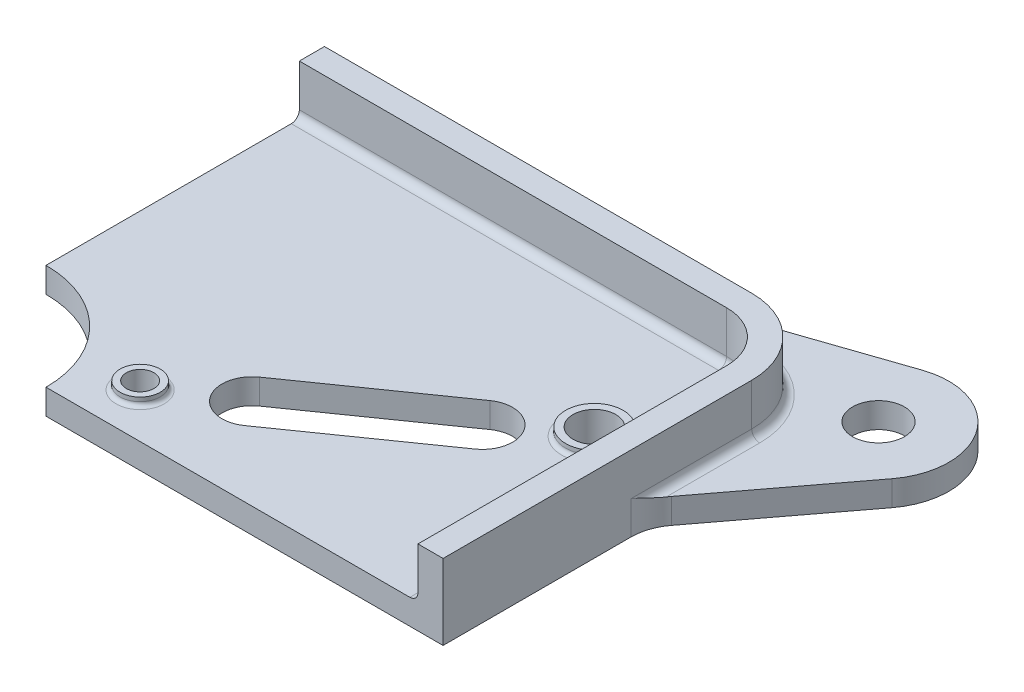
ISO-10303-21;
HEADER;
FILE_DESCRIPTION(('STEP AP214'),'2;1');
FILE_NAME('part.step','',(''),(''),'','','');
FILE_SCHEMA(('AUTOMOTIVE_DESIGN { 1 0 10303 214 1 1 1 1 }'));
ENDSEC;
DATA;
#1=APPLICATION_CONTEXT('core data for automotive mechanical design processes');
#2=APPLICATION_PROTOCOL_DEFINITION('international standard','automotive_design',2000,#1);
#3=PRODUCT_CONTEXT('',#1,'mechanical');
#4=PRODUCT('Part','Part','',(#3));
#5=PRODUCT_RELATED_PRODUCT_CATEGORY('part','',(#4));
#6=PRODUCT_DEFINITION_FORMATION('','',#4);
#7=PRODUCT_DEFINITION_CONTEXT('part definition',#1,'design');
#8=PRODUCT_DEFINITION('design','',#6,#7);
#9=PRODUCT_DEFINITION_SHAPE('','',#8);
#10=(LENGTH_UNIT() NAMED_UNIT(*) SI_UNIT(.MILLI.,.METRE.));
#11=(NAMED_UNIT(*) PLANE_ANGLE_UNIT() SI_UNIT($,.RADIAN.));
#12=(NAMED_UNIT(*) SI_UNIT($,.STERADIAN.) SOLID_ANGLE_UNIT());
#13=UNCERTAINTY_MEASURE_WITH_UNIT(LENGTH_MEASURE(1.E-05),#10,'distance_accuracy_value','');
#14=(GEOMETRIC_REPRESENTATION_CONTEXT(3) GLOBAL_UNCERTAINTY_ASSIGNED_CONTEXT((#13)) GLOBAL_UNIT_ASSIGNED_CONTEXT((#10,
#11,#12)) REPRESENTATION_CONTEXT('',''));
#15=CARTESIAN_POINT('',(0.,0.,0.));
#16=DIRECTION('',(0.,0.,1.));
#17=DIRECTION('',(1.,0.,0.));
#18=AXIS2_PLACEMENT_3D('',#15,#16,#17);
#19=CARTESIAN_POINT('',(53.975,9.525,-38.989));
#20=DIRECTION('',(0.,-1.,0.));
#21=DIRECTION('',(0.,0.,-1.));
#22=AXIS2_PLACEMENT_3D('',#19,#20,#21);
#23=PLANE('',#22);
#24=DIRECTION('',(-1.,0.,0.));
#25=VECTOR('',#24,1.);
#26=CARTESIAN_POINT('',(53.975,9.525,-45.339));
#27=LINE('',#26,#25);
#28=CARTESIAN_POINT('',(53.975,9.525,-45.339));
#29=VERTEX_POINT('',#28);
#30=CARTESIAN_POINT('',(0.,9.525,-45.339));
#31=VERTEX_POINT('',#30);
#32=EDGE_CURVE('E243',#29,#31,#27,.T.);
#33=ORIENTED_EDGE('',*,*,#32,.F.);
#34=CARTESIAN_POINT('',(53.975,9.525,-38.989));
#35=DIRECTION('',(0.,-1.,0.));
#36=DIRECTION('',(0.,0.,-1.));
#37=AXIS2_PLACEMENT_3D('',#34,#35,#36);
#38=CIRCLE('',#37,6.35);
#39=CARTESIAN_POINT('',(60.325,9.525,-38.9889999999999));
#40=VERTEX_POINT('',#39);
#41=EDGE_CURVE('E236',#40,#29,#38,.F.);
#42=ORIENTED_EDGE('',*,*,#41,.F.);
#43=DIRECTION('',(0.,0.,-1.));
#44=VECTOR('',#43,1.);
#45=CARTESIAN_POINT('',(60.325,9.525,-38.989));
#46=LINE('',#45,#44);
#47=CARTESIAN_POINT('',(60.325,9.525,0.));
#48=VERTEX_POINT('',#47);
#49=EDGE_CURVE('E248',#48,#40,#46,.T.);
#50=ORIENTED_EDGE('',*,*,#49,.F.);
#51=DIRECTION('',(1.,0.,0.));
#52=VECTOR('',#51,1.);
#53=CARTESIAN_POINT('',(13.335,9.525,0.));
#54=LINE('',#53,#52);
#55=CARTESIAN_POINT('',(63.5,9.525,0.));
#56=VERTEX_POINT('',#55);
#57=EDGE_CURVE('E296',#48,#56,#54,.T.);
#58=ORIENTED_EDGE('',*,*,#57,.T.);
#59=DIRECTION('',(0.,0.,-1.));
#60=VECTOR('',#59,1.);
#61=CARTESIAN_POINT('',(63.5,9.525,0.));
#62=LINE('',#61,#60);
#63=CARTESIAN_POINT('',(63.5,9.525,-38.9889999999999));
#64=VERTEX_POINT('',#63);
#65=EDGE_CURVE('E298',#56,#64,#62,.T.);
#66=ORIENTED_EDGE('',*,*,#65,.T.);
#67=CARTESIAN_POINT('',(53.975,9.525,-38.989));
#68=DIRECTION('',(0.,1.,0.));
#69=DIRECTION('',(0.,0.,-1.));
#70=AXIS2_PLACEMENT_3D('',#67,#68,#69);
#71=CIRCLE('',#70,9.525);
#72=CARTESIAN_POINT('',(53.9749999999999,9.525,-48.514));
#73=VERTEX_POINT('',#72);
#74=EDGE_CURVE('E300',#64,#73,#71,.T.);
#75=ORIENTED_EDGE('',*,*,#74,.T.);
#76=DIRECTION('',(-1.,0.,0.));
#77=VECTOR('',#76,1.);
#78=CARTESIAN_POINT('',(0.,9.525,-48.514));
#79=LINE('',#78,#77);
#80=CARTESIAN_POINT('',(0.,9.525,-48.514));
#81=VERTEX_POINT('',#80);
#82=EDGE_CURVE('E289',#73,#81,#79,.T.);
#83=ORIENTED_EDGE('',*,*,#82,.T.);
#84=DIRECTION('',(0.,0.,1.));
#85=VECTOR('',#84,1.);
#86=CARTESIAN_POINT('',(0.,9.525,-13.335));
#87=LINE('',#86,#85);
#88=EDGE_CURVE('E292',#81,#31,#87,.T.);
#89=ORIENTED_EDGE('',*,*,#88,.T.);
#90=EDGE_LOOP('',(#33,#42,#50,#58,#66,#75,#83,#89));
#91=FACE_BOUND('',#90,.T.);
#92=ADVANCED_FACE('F31',(#91),#23,.F.);
#93=CARTESIAN_POINT('',(0.,9.525,-13.335));
#94=DIRECTION('',(1.,0.,0.));
#95=DIRECTION('',(0.,0.,-1.));
#96=AXIS2_PLACEMENT_3D('',#93,#94,#95);
#97=PLANE('',#96);
#98=DIRECTION('',(0.,0.,1.));
#99=VECTOR('',#98,1.);
#100=CARTESIAN_POINT('',(0.,3.175,-38.989));
#101=LINE('',#100,#99);
#102=CARTESIAN_POINT('',(0.,3.175,-44.323));
#103=VERTEX_POINT('',#102);
#104=CARTESIAN_POINT('',(0.,3.175,-13.335));
#105=VERTEX_POINT('',#104);
#106=EDGE_CURVE('E255',#103,#105,#101,.T.);
#107=ORIENTED_EDGE('',*,*,#106,.F.);
#108=CARTESIAN_POINT('',(0.,4.191,-44.323));
#109=DIRECTION('',(1.,0.,0.));
#110=DIRECTION('',(0.,0.,-1.));
#111=AXIS2_PLACEMENT_3D('',#108,#109,#110);
#112=CIRCLE('',#111,1.016);
#113=CARTESIAN_POINT('',(0.,4.191,-45.339));
#114=VERTEX_POINT('',#113);
#115=EDGE_CURVE('E500',#103,#114,#112,.T.);
#116=ORIENTED_EDGE('',*,*,#115,.T.);
#117=DIRECTION('',(0.,-1.,0.));
#118=VECTOR('',#117,1.);
#119=CARTESIAN_POINT('',(0.,9.525,-45.339));
#120=LINE('',#119,#118);
#121=EDGE_CURVE('E247',#31,#114,#120,.T.);
#122=ORIENTED_EDGE('',*,*,#121,.F.);
#123=ORIENTED_EDGE('',*,*,#88,.F.);
#124=DIRECTION('',(0.,-1.,0.));
#125=VECTOR('',#124,1.);
#126=CARTESIAN_POINT('',(0.,9.525,-48.514));
#127=LINE('',#126,#125);
#128=CARTESIAN_POINT('',(0.,0.,-48.514));
#129=VERTEX_POINT('',#128);
#130=EDGE_CURVE('E325',#81,#129,#127,.T.);
#131=ORIENTED_EDGE('',*,*,#130,.T.);
#132=DIRECTION('',(0.,0.,1.));
#133=VECTOR('',#132,1.);
#134=CARTESIAN_POINT('',(0.,0.,-13.335));
#135=LINE('',#134,#133);
#136=CARTESIAN_POINT('',(0.,0.,-13.335));
#137=VERTEX_POINT('',#136);
#138=EDGE_CURVE('E304',#129,#137,#135,.T.);
#139=ORIENTED_EDGE('',*,*,#138,.T.);
#140=DIRECTION('',(0.,-1.,0.));
#141=VECTOR('',#140,1.);
#142=CARTESIAN_POINT('',(0.,9.525,-13.335));
#143=LINE('',#142,#141);
#144=EDGE_CURVE('E323',#105,#137,#143,.T.);
#145=ORIENTED_EDGE('',*,*,#144,.F.);
#146=EDGE_LOOP('',(#107,#116,#122,#123,#131,#139,#145));
#147=FACE_BOUND('',#146,.T.);
#148=ADVANCED_FACE('F438',(#147),#97,.F.);
#149=CARTESIAN_POINT('',(0.,9.525,0.));
#150=DIRECTION('',(0.,-1.,0.));
#151=DIRECTION('',(0.,0.,-1.));
#152=AXIS2_PLACEMENT_3D('',#149,#150,#151);
#153=CYLINDRICAL_SURFACE('',#152,13.335);
#154=CARTESIAN_POINT('',(0.,3.175,0.));
#155=DIRECTION('',(0.,-1.,0.));
#156=DIRECTION('',(0.,0.,-1.));
#157=AXIS2_PLACEMENT_3D('',#154,#155,#156);
#158=CIRCLE('',#157,13.335);
#159=CARTESIAN_POINT('',(13.335,3.175,0.));
#160=VERTEX_POINT('',#159);
#161=EDGE_CURVE('E244',#105,#160,#158,.T.);
#162=ORIENTED_EDGE('',*,*,#161,.F.);
#163=ORIENTED_EDGE('',*,*,#144,.T.);
#164=CARTESIAN_POINT('',(0.,0.,0.));
#165=DIRECTION('',(0.,-1.,0.));
#166=DIRECTION('',(0.,0.,1.));
#167=AXIS2_PLACEMENT_3D('',#164,#165,#166);
#168=CIRCLE('',#167,13.335);
#169=CARTESIAN_POINT('',(13.335,0.,0.));
#170=VERTEX_POINT('',#169);
#171=EDGE_CURVE('E307',#137,#170,#168,.T.);
#172=ORIENTED_EDGE('',*,*,#171,.T.);
#173=DIRECTION('',(0.,-1.,0.));
#174=VECTOR('',#173,1.);
#175=CARTESIAN_POINT('',(13.335,9.525,0.));
#176=LINE('',#175,#174);
#177=EDGE_CURVE('E321',#160,#170,#176,.T.);
#178=ORIENTED_EDGE('',*,*,#177,.F.);
#179=EDGE_LOOP('',(#162,#163,#172,#178));
#180=FACE_BOUND('',#179,.T.);
#181=ADVANCED_FACE('F444',(#180),#153,.F.);
#182=CARTESIAN_POINT('',(13.335,9.525,0.));
#183=DIRECTION('',(0.,0.,-1.));
#184=DIRECTION('',(-1.,0.,0.));
#185=AXIS2_PLACEMENT_3D('',#182,#183,#184);
#186=PLANE('',#185);
#187=DIRECTION('',(1.,0.,0.));
#188=VECTOR('',#187,1.);
#189=CARTESIAN_POINT('',(53.975,3.175,0.));
#190=LINE('',#189,#188);
#191=CARTESIAN_POINT('',(59.309,3.175,0.));
#192=VERTEX_POINT('',#191);
#193=EDGE_CURVE('E240',#160,#192,#190,.T.);
#194=ORIENTED_EDGE('',*,*,#193,.F.);
#195=ORIENTED_EDGE('',*,*,#177,.T.);
#196=DIRECTION('',(1.,0.,0.));
#197=VECTOR('',#196,1.);
#198=CARTESIAN_POINT('',(13.335,0.,0.));
#199=LINE('',#198,#197);
#200=CARTESIAN_POINT('',(63.5,0.,0.));
#201=VERTEX_POINT('',#200);
#202=EDGE_CURVE('E310',#170,#201,#199,.T.);
#203=ORIENTED_EDGE('',*,*,#202,.T.);
#204=DIRECTION('',(0.,-1.,0.));
#205=VECTOR('',#204,1.);
#206=CARTESIAN_POINT('',(63.5,9.525,0.));
#207=LINE('',#206,#205);
#208=EDGE_CURVE('E318',#56,#201,#207,.T.);
#209=ORIENTED_EDGE('',*,*,#208,.F.);
#210=ORIENTED_EDGE('',*,*,#57,.F.);
#211=DIRECTION('',(0.,-1.,0.));
#212=VECTOR('',#211,1.);
#213=CARTESIAN_POINT('',(60.325,9.525,0.));
#214=LINE('',#213,#212);
#215=CARTESIAN_POINT('',(60.325,4.191,0.));
#216=VERTEX_POINT('',#215);
#217=EDGE_CURVE('E239',#48,#216,#214,.T.);
#218=ORIENTED_EDGE('',*,*,#217,.T.);
#219=CARTESIAN_POINT('',(59.309,4.191,0.));
#220=DIRECTION('',(0.,0.,-1.));
#221=DIRECTION('',(-1.,0.,0.));
#222=AXIS2_PLACEMENT_3D('',#219,#220,#221);
#223=CIRCLE('',#222,1.016);
#224=EDGE_CURVE('E402',#216,#192,#223,.T.);
#225=ORIENTED_EDGE('',*,*,#224,.T.);
#226=EDGE_LOOP('',(#194,#195,#203,#209,#210,#218,#225));
#227=FACE_BOUND('',#226,.T.);
#228=ADVANCED_FACE('F464',(#227),#186,.F.);
#229=CARTESIAN_POINT('',(27.9025881566682,9.525,-11.4756071786794));
#230=DIRECTION('',(0.,-1.,0.));
#231=DIRECTION('',(0.,0.,-1.));
#232=AXIS2_PLACEMENT_3D('',#229,#230,#231);
#233=CYLINDRICAL_SURFACE('',#232,3.81);
#234=DIRECTION('',(0.,-1.,0.));
#235=VECTOR('',#234,1.);
#236=CARTESIAN_POINT('',(25.7172619341707,9.525,-14.5965764674205));
#237=LINE('',#236,#235);
#238=CARTESIAN_POINT('',(25.7172619341707,3.175,-14.5965764674205));
#239=VERTEX_POINT('',#238);
#240=CARTESIAN_POINT('',(25.7172619341707,0.,-14.5965764674205));
#241=VERTEX_POINT('',#240);
#242=EDGE_CURVE('E280',#239,#241,#237,.T.);
#243=ORIENTED_EDGE('',*,*,#242,.F.);
#244=CARTESIAN_POINT('',(27.9025881566682,3.175,-11.4756071786794));
#245=DIRECTION('',(0.,-1.,0.));
#246=DIRECTION('',(0.,0.,-1.));
#247=AXIS2_PLACEMENT_3D('',#244,#245,#246);
#248=CIRCLE('',#247,3.81);
#249=CARTESIAN_POINT('',(30.0879143791657,3.175,-8.35463788993839));
#250=VERTEX_POINT('',#249);
#251=EDGE_CURVE('E215',#239,#250,#248,.F.);
#252=ORIENTED_EDGE('',*,*,#251,.T.);
#253=DIRECTION('',(0.,-1.,0.));
#254=VECTOR('',#253,1.);
#255=CARTESIAN_POINT('',(30.0879143791657,9.525,-8.35463788993839));
#256=LINE('',#255,#254);
#257=CARTESIAN_POINT('',(30.0879143791657,0.,-8.35463788993839));
#258=VERTEX_POINT('',#257);
#259=EDGE_CURVE('E286',#250,#258,#256,.T.);
#260=ORIENTED_EDGE('',*,*,#259,.T.);
#261=CARTESIAN_POINT('',(27.9025881566682,0.,-11.4756071786794));
#262=DIRECTION('',(0.,1.,0.));
#263=DIRECTION('',(0.,0.,1.));
#264=AXIS2_PLACEMENT_3D('',#261,#262,#263);
#265=CIRCLE('',#264,3.81);
#266=EDGE_CURVE('E254',#241,#258,#265,.T.);
#267=ORIENTED_EDGE('',*,*,#266,.F.);
#268=EDGE_LOOP('',(#243,#252,#260,#267));
#269=FACE_BOUND('',#268,.T.);
#270=ADVANCED_FACE('F449',(#269),#233,.F.);
#271=CARTESIAN_POINT('',(30.0879143791657,9.525,-8.35463788993839));
#272=DIRECTION('',(-0.573576436351047,0.,-0.819152044288991));
#273=DIRECTION('',(-0.819152044288991,0.,0.573576436351047));
#274=AXIS2_PLACEMENT_3D('',#271,#272,#273);
#275=PLANE('',#274);
#276=ORIENTED_EDGE('',*,*,#259,.F.);
#277=DIRECTION('',(0.819152044288991,0.,-0.573576436351047));
#278=VECTOR('',#277,1.);
#279=CARTESIAN_POINT('',(60.5098314220721,3.175,-29.656293530172));
#280=LINE('',#279,#278);
#281=CARTESIAN_POINT('',(47.1970680200442,3.175,-20.3345962416696));
#282=VERTEX_POINT('',#281);
#283=EDGE_CURVE('E264',#250,#282,#280,.T.);
#284=ORIENTED_EDGE('',*,*,#283,.T.);
#285=DIRECTION('',(0.,-1.,0.));
#286=VECTOR('',#285,1.);
#287=CARTESIAN_POINT('',(47.1970680200442,9.525,-20.3345962416696));
#288=LINE('',#287,#286);
#289=CARTESIAN_POINT('',(47.1970680200442,0.,-20.3345962416696));
#290=VERTEX_POINT('',#289);
#291=EDGE_CURVE('E284',#282,#290,#288,.T.);
#292=ORIENTED_EDGE('',*,*,#291,.T.);
#293=DIRECTION('',(0.819152044288991,0.,-0.573576436351047));
#294=VECTOR('',#293,1.);
#295=CARTESIAN_POINT('',(30.0879143791657,0.,-8.35463788993839));
#296=LINE('',#295,#294);
#297=EDGE_CURVE('E271',#258,#290,#296,.T.);
#298=ORIENTED_EDGE('',*,*,#297,.F.);
#299=EDGE_LOOP('',(#276,#284,#292,#298));
#300=FACE_BOUND('',#299,.T.);
#301=ADVANCED_FACE('F563',(#300),#275,.T.);
#302=CARTESIAN_POINT('',(45.0117417975467,9.525,-23.4555655304107));
#303=DIRECTION('',(0.,-1.,0.));
#304=DIRECTION('',(0.,0.,-1.));
#305=AXIS2_PLACEMENT_3D('',#302,#303,#304);
#306=CYLINDRICAL_SURFACE('',#305,3.81);
#307=ORIENTED_EDGE('',*,*,#291,.F.);
#308=CARTESIAN_POINT('',(45.0117417975467,3.175,-23.4555655304107));
#309=DIRECTION('',(0.,-1.,0.));
#310=DIRECTION('',(0.,0.,-1.));
#311=AXIS2_PLACEMENT_3D('',#308,#309,#310);
#312=CIRCLE('',#311,3.81);
#313=CARTESIAN_POINT('',(42.8264155750492,3.175,-26.5765348191517));
#314=VERTEX_POINT('',#313);
#315=EDGE_CURVE('E261',#282,#314,#312,.F.);
#316=ORIENTED_EDGE('',*,*,#315,.T.);
#317=DIRECTION('',(0.,-1.,0.));
#318=VECTOR('',#317,1.);
#319=CARTESIAN_POINT('',(42.8264155750492,9.525,-26.5765348191517));
#320=LINE('',#319,#318);
#321=CARTESIAN_POINT('',(42.8264155750492,0.,-26.5765348191517));
#322=VERTEX_POINT('',#321);
#323=EDGE_CURVE('E282',#314,#322,#320,.T.);
#324=ORIENTED_EDGE('',*,*,#323,.T.);
#325=CARTESIAN_POINT('',(45.0117417975467,0.,-23.4555655304107));
#326=DIRECTION('',(0.,1.,0.));
#327=DIRECTION('',(0.,0.,1.));
#328=AXIS2_PLACEMENT_3D('',#325,#326,#327);
#329=CIRCLE('',#328,3.81);
#330=EDGE_CURVE('E274',#290,#322,#329,.T.);
#331=ORIENTED_EDGE('',*,*,#330,.F.);
#332=EDGE_LOOP('',(#307,#316,#324,#331));
#333=FACE_BOUND('',#332,.T.);
#334=ADVANCED_FACE('F555',(#333),#306,.F.);
#335=CARTESIAN_POINT('',(25.7172619341707,9.525,-14.5965764674205));
#336=DIRECTION('',(0.573576436351047,0.,0.819152044288991));
#337=DIRECTION('',(0.819152044288991,0.,-0.573576436351048));
#338=AXIS2_PLACEMENT_3D('',#335,#336,#337);
#339=PLANE('',#338);
#340=ORIENTED_EDGE('',*,*,#323,.F.);
#341=DIRECTION('',(-0.819152044288991,0.,0.573576436351048));
#342=VECTOR('',#341,1.);
#343=CARTESIAN_POINT('',(56.1391789770771,3.175,-35.8982321076541));
#344=LINE('',#343,#342);
#345=EDGE_CURVE('E257',#314,#239,#344,.T.);
#346=ORIENTED_EDGE('',*,*,#345,.T.);
#347=ORIENTED_EDGE('',*,*,#242,.T.);
#348=DIRECTION('',(-0.819152044288991,0.,0.573576436351047));
#349=VECTOR('',#348,1.);
#350=CARTESIAN_POINT('',(25.7172619341707,0.,-14.5965764674205));
#351=LINE('',#350,#349);
#352=EDGE_CURVE('E277',#322,#241,#351,.T.);
#353=ORIENTED_EDGE('',*,*,#352,.F.);
#354=EDGE_LOOP('',(#340,#346,#347,#353));
#355=FACE_BOUND('',#354,.T.);
#356=ADVANCED_FACE('F454',(#355),#339,.T.);
#357=CARTESIAN_POINT('',(53.975,0.,-38.989));
#358=DIRECTION('',(0.,-1.,0.));
#359=DIRECTION('',(0.,0.,-1.));
#360=AXIS2_PLACEMENT_3D('',#357,#358,#359);
#361=PLANE('',#360);
#362=CARTESIAN_POINT('',(19.5800033866921,0.,-5.6480705853528));
#363=DIRECTION('',(0.,1.,0.));
#364=DIRECTION('',(0.,0.,1.));
#365=AXIS2_PLACEMENT_3D('',#362,#363,#364);
#366=CIRCLE('',#365,1.7399);
#367=CARTESIAN_POINT('',(19.5800033866921,0.,-3.9081705853528));
#368=VERTEX_POINT('',#367);
#369=EDGE_CURVE('E621',#368,#368,#366,.T.);
#370=ORIENTED_EDGE('',*,*,#369,.T.);
#371=EDGE_LOOP('',(#370));
#372=FACE_BOUND('',#371,.T.);
#373=CARTESIAN_POINT('',(53.3343265675228,0.,-29.2831021237373));
#374=DIRECTION('',(0.,1.,0.));
#375=DIRECTION('',(0.,0.,1.));
#376=AXIS2_PLACEMENT_3D('',#373,#374,#375);
#377=CIRCLE('',#376,2.70883195162614);
#378=CARTESIAN_POINT('',(53.3343265675228,0.,-26.5742701721112));
#379=VERTEX_POINT('',#378);
#380=EDGE_CURVE('E617',#379,#379,#377,.T.);
#381=ORIENTED_EDGE('',*,*,#380,.T.);
#382=EDGE_LOOP('',(#381));
#383=FACE_BOUND('',#382,.T.);
#384=DIRECTION('',(-1.,0.,0.));
#385=VECTOR('',#384,1.);
#386=CARTESIAN_POINT('',(0.,0.,-48.514));
#387=LINE('',#386,#385);
#388=CARTESIAN_POINT('',(40.2719621883183,0.,-48.514));
#389=VERTEX_POINT('',#388);
#390=EDGE_CURVE('E288',#389,#129,#387,.T.);
#391=ORIENTED_EDGE('',*,*,#390,.F.);
#392=CARTESIAN_POINT('',(40.2719621883183,0.,-54.864));
#393=DIRECTION('',(0.,-1.,0.));
#394=DIRECTION('',(0.,0.,-1.));
#395=AXIS2_PLACEMENT_3D('',#392,#393,#394);
#396=CIRCLE('',#395,6.35);
#397=CARTESIAN_POINT('',(42.3231435718088,0.,-48.8544114174079));
#398=VERTEX_POINT('',#397);
#399=EDGE_CURVE('E335',#389,#398,#396,.F.);
#400=ORIENTED_EDGE('',*,*,#399,.T.);
#401=DIRECTION('',(-0.946391902770415,0.,0.323020690313474));
#402=VECTOR('',#401,1.);
#403=CARTESIAN_POINT('',(41.3258,0.,-48.514));
#404=LINE('',#403,#402);
#405=CARTESIAN_POINT('',(66.8299935116635,0.,-57.2190429847396));
#406=VERTEX_POINT('',#405);
#407=EDGE_CURVE('E206',#406,#398,#404,.T.);
#408=ORIENTED_EDGE('',*,*,#407,.F.);
#409=CARTESIAN_POINT('',(69.7016474485502,0.,-48.8056189691106));
#410=DIRECTION('',(0.,1.,0.));
#411=DIRECTION('',(0.,0.,1.));
#412=AXIS2_PLACEMENT_3D('',#409,#410,#411);
#413=CIRCLE('',#412,8.88999999999998);
#414=CARTESIAN_POINT('',(76.7937093319148,0.,-43.4451378113668));
#415=VERTEX_POINT('',#414);
#416=EDGE_CURVE('E227',#415,#406,#413,.T.);
#417=ORIENTED_EDGE('',*,*,#416,.F.);
#418=DIRECTION('',(0.602978757901443,0.,-0.797757242223242));
#419=VECTOR('',#418,1.);
#420=CARTESIAN_POINT('',(63.5,0.,-25.8572));
#421=LINE('',#420,#419);
#422=CARTESIAN_POINT('',(64.7842415118824,0.,-27.5562863333785));
#423=VERTEX_POINT('',#422);
#424=EDGE_CURVE('E212',#423,#415,#421,.T.);
#425=ORIENTED_EDGE('',*,*,#424,.F.);
#426=CARTESIAN_POINT('',(69.85,0.,-23.7273712207044));
#427=DIRECTION('',(0.,-1.,0.));
#428=DIRECTION('',(0.,0.,-1.));
#429=AXIS2_PLACEMENT_3D('',#426,#427,#428);
#430=CIRCLE('',#429,6.35);
#431=CARTESIAN_POINT('',(63.5,0.,-23.7273712207044));
#432=VERTEX_POINT('',#431);
#433=EDGE_CURVE('E337',#423,#432,#430,.F.);
#434=ORIENTED_EDGE('',*,*,#433,.T.);
#435=DIRECTION('',(0.,0.,-1.));
#436=VECTOR('',#435,1.);
#437=CARTESIAN_POINT('',(63.5,0.,0.));
#438=LINE('',#437,#436);
#439=EDGE_CURVE('E293',#201,#432,#438,.T.);
#440=ORIENTED_EDGE('',*,*,#439,.F.);
#441=ORIENTED_EDGE('',*,*,#202,.F.);
#442=ORIENTED_EDGE('',*,*,#171,.F.);
#443=ORIENTED_EDGE('',*,*,#138,.F.);
#444=EDGE_LOOP('',(#391,#400,#408,#417,#425,#434,#440,#441,#442,#443));
#445=FACE_BOUND('',#444,.T.);
#446=ORIENTED_EDGE('',*,*,#352,.T.);
#447=ORIENTED_EDGE('',*,*,#266,.T.);
#448=ORIENTED_EDGE('',*,*,#297,.T.);
#449=ORIENTED_EDGE('',*,*,#330,.T.);
#450=EDGE_LOOP('',(#446,#447,#448,#449));
#451=FACE_BOUND('',#450,.T.);
#452=CARTESIAN_POINT('',(69.7016474485502,0.,-48.8056189691106));
#453=DIRECTION('',(0.,1.,0.));
#454=DIRECTION('',(0.,0.,1.));
#455=AXIS2_PLACEMENT_3D('',#452,#453,#454);
#456=CIRCLE('',#455,3.27290841220234);
#457=CARTESIAN_POINT('',(69.7016474485502,0.,-45.5327105569083));
#458=VERTEX_POINT('',#457);
#459=EDGE_CURVE('E632',#458,#458,#456,.T.);
#460=ORIENTED_EDGE('',*,*,#459,.T.);
#461=EDGE_LOOP('',(#460));
#462=FACE_BOUND('',#461,.T.);
#463=ADVANCED_FACE('F451',(#372,#383,#445,#451,#462),#361,.T.);
#464=CARTESIAN_POINT('',(0.,9.525,-48.514));
#465=DIRECTION('',(0.,0.,1.));
#466=DIRECTION('',(1.,0.,0.));
#467=AXIS2_PLACEMENT_3D('',#464,#465,#466);
#468=PLANE('',#467);
#469=DIRECTION('',(0.,-1.,0.));
#470=VECTOR('',#469,1.);
#471=CARTESIAN_POINT('',(53.9749999999999,9.525,-48.514));
#472=LINE('',#471,#470);
#473=CARTESIAN_POINT('',(53.9749999999999,4.191,-48.514));
#474=VERTEX_POINT('',#473);
#475=EDGE_CURVE('E302',#73,#474,#472,.T.);
#476=ORIENTED_EDGE('',*,*,#475,.T.);
#477=DIRECTION('',(1.,0.,0.));
#478=VECTOR('',#477,1.);
#479=CARTESIAN_POINT('',(0.,4.191,-48.514));
#480=LINE('',#479,#478);
#481=CARTESIAN_POINT('',(40.2719621883183,4.191,-48.514));
#482=VERTEX_POINT('',#481);
#483=EDGE_CURVE('E347',#474,#482,#480,.F.);
#484=ORIENTED_EDGE('',*,*,#483,.T.);
#485=DIRECTION('',(0.,-1.,0.));
#486=VECTOR('',#485,1.);
#487=CARTESIAN_POINT('',(40.2719621883183,0.,-48.514));
#488=LINE('',#487,#486);
#489=EDGE_CURVE('E328',#482,#389,#488,.T.);
#490=ORIENTED_EDGE('',*,*,#489,.T.);
#491=ORIENTED_EDGE('',*,*,#390,.T.);
#492=ORIENTED_EDGE('',*,*,#130,.F.);
#493=ORIENTED_EDGE('',*,*,#82,.F.);
#494=EDGE_LOOP('',(#476,#484,#490,#491,#492,#493));
#495=FACE_BOUND('',#494,.T.);
#496=ADVANCED_FACE('F387',(#495),#468,.F.);
#497=CARTESIAN_POINT('',(63.5,9.525,0.));
#498=DIRECTION('',(-1.,0.,0.));
#499=DIRECTION('',(0.,0.,1.));
#500=AXIS2_PLACEMENT_3D('',#497,#498,#499);
#501=PLANE('',#500);
#502=DIRECTION('',(0.,-1.,0.));
#503=VECTOR('',#502,1.);
#504=CARTESIAN_POINT('',(63.5,3.175,-23.7273712207044));
#505=LINE('',#504,#503);
#506=CARTESIAN_POINT('',(63.5,4.191,-23.7273712207044));
#507=VERTEX_POINT('',#506);
#508=EDGE_CURVE('E54',#432,#507,#505,.F.);
#509=ORIENTED_EDGE('',*,*,#508,.T.);
#510=DIRECTION('',(0.,0.,1.));
#511=VECTOR('',#510,1.);
#512=CARTESIAN_POINT('',(63.5,4.191,0.));
#513=LINE('',#512,#511);
#514=CARTESIAN_POINT('',(63.5,4.191,-38.9889999999999));
#515=VERTEX_POINT('',#514);
#516=EDGE_CURVE('E365',#507,#515,#513,.F.);
#517=ORIENTED_EDGE('',*,*,#516,.T.);
#518=DIRECTION('',(0.,-1.,0.));
#519=VECTOR('',#518,1.);
#520=CARTESIAN_POINT('',(63.5,9.525,-38.9889999999999));
#521=LINE('',#520,#519);
#522=EDGE_CURVE('E315',#64,#515,#521,.T.);
#523=ORIENTED_EDGE('',*,*,#522,.F.);
#524=ORIENTED_EDGE('',*,*,#65,.F.);
#525=ORIENTED_EDGE('',*,*,#208,.T.);
#526=ORIENTED_EDGE('',*,*,#439,.T.);
#527=EDGE_LOOP('',(#509,#517,#523,#524,#525,#526));
#528=FACE_BOUND('',#527,.T.);
#529=ADVANCED_FACE('F460',(#528),#501,.F.);
#530=CARTESIAN_POINT('',(53.975,9.525,-38.989));
#531=DIRECTION('',(0.,-1.,0.));
#532=DIRECTION('',(0.,0.,-1.));
#533=AXIS2_PLACEMENT_3D('',#530,#531,#532);
#534=CYLINDRICAL_SURFACE('',#533,9.525);
#535=ORIENTED_EDGE('',*,*,#522,.T.);
#536=CARTESIAN_POINT('',(53.975,4.191,-38.989));
#537=DIRECTION('',(0.,1.,0.));
#538=DIRECTION('',(0.,0.,1.));
#539=AXIS2_PLACEMENT_3D('',#536,#537,#538);
#540=CIRCLE('',#539,9.525);
#541=EDGE_CURVE('E363',#515,#474,#540,.T.);
#542=ORIENTED_EDGE('',*,*,#541,.T.);
#543=ORIENTED_EDGE('',*,*,#475,.F.);
#544=ORIENTED_EDGE('',*,*,#74,.F.);
#545=EDGE_LOOP('',(#535,#542,#543,#544));
#546=FACE_BOUND('',#545,.T.);
#547=ADVANCED_FACE('F456',(#546),#534,.T.);
#548=CARTESIAN_POINT('',(53.975,3.175,-38.989));
#549=DIRECTION('',(0.,-1.,0.));
#550=DIRECTION('',(0.,0.,-1.));
#551=AXIS2_PLACEMENT_3D('',#548,#549,#550);
#552=PLANE('',#551);
#553=CARTESIAN_POINT('',(53.3343265675228,3.175,-29.2831021237373));
#554=DIRECTION('',(0.,-1.,0.));
#555=DIRECTION('',(0.,0.,-1.));
#556=AXIS2_PLACEMENT_3D('',#553,#554,#555);
#557=CIRCLE('',#556,4.14155411699203);
#558=CARTESIAN_POINT('',(53.3343265675228,3.175,-33.4246562407293));
#559=VERTEX_POINT('',#558);
#560=EDGE_CURVE('E39',#559,#559,#557,.T.);
#561=ORIENTED_EDGE('',*,*,#560,.T.);
#562=EDGE_LOOP('',(#561));
#563=FACE_BOUND('',#562,.T.);
#564=CARTESIAN_POINT('',(19.5800033866921,3.175,-5.6480705853528));
#565=DIRECTION('',(0.,-1.,0.));
#566=DIRECTION('',(0.,0.,-1.));
#567=AXIS2_PLACEMENT_3D('',#564,#565,#566);
#568=CIRCLE('',#567,3.048);
#569=CARTESIAN_POINT('',(19.5800033866921,3.175,-8.6960705853528));
#570=VERTEX_POINT('',#569);
#571=EDGE_CURVE('E541',#570,#570,#568,.T.);
#572=ORIENTED_EDGE('',*,*,#571,.T.);
#573=EDGE_LOOP('',(#572));
#574=FACE_BOUND('',#573,.T.);
#575=CARTESIAN_POINT('',(53.975,3.175,-38.989));
#576=DIRECTION('',(0.,-1.,0.));
#577=DIRECTION('',(0.,0.,-1.));
#578=AXIS2_PLACEMENT_3D('',#575,#576,#577);
#579=CIRCLE('',#578,5.334);
#580=CARTESIAN_POINT('',(59.309,3.175,-38.989));
#581=VERTEX_POINT('',#580);
#582=CARTESIAN_POINT('',(53.9749999999999,3.175,-44.323));
#583=VERTEX_POINT('',#582);
#584=EDGE_CURVE('E352',#581,#583,#579,.F.);
#585=ORIENTED_EDGE('',*,*,#584,.T.);
#586=DIRECTION('',(-1.,0.,0.));
#587=VECTOR('',#586,1.);
#588=CARTESIAN_POINT('',(53.975,3.175,-44.323));
#589=LINE('',#588,#587);
#590=EDGE_CURVE('E354',#583,#103,#589,.T.);
#591=ORIENTED_EDGE('',*,*,#590,.T.);
#592=ORIENTED_EDGE('',*,*,#106,.T.);
#593=ORIENTED_EDGE('',*,*,#161,.T.);
#594=ORIENTED_EDGE('',*,*,#193,.T.);
#595=DIRECTION('',(0.,0.,-1.));
#596=VECTOR('',#595,1.);
#597=CARTESIAN_POINT('',(59.309,3.175,-38.989));
#598=LINE('',#597,#596);
#599=EDGE_CURVE('E350',#192,#581,#598,.T.);
#600=ORIENTED_EDGE('',*,*,#599,.T.);
#601=EDGE_LOOP('',(#585,#591,#592,#593,#594,#600));
#602=FACE_BOUND('',#601,.T.);
#603=ORIENTED_EDGE('',*,*,#345,.F.);
#604=ORIENTED_EDGE('',*,*,#315,.F.);
#605=ORIENTED_EDGE('',*,*,#283,.F.);
#606=ORIENTED_EDGE('',*,*,#251,.F.);
#607=EDGE_LOOP('',(#603,#604,#605,#606));
#608=FACE_BOUND('',#607,.T.);
#609=ADVANCED_FACE('F459',(#563,#574,#602,#608),#552,.F.);
#610=CARTESIAN_POINT('',(0.,9.525,-45.339));
#611=DIRECTION('',(0.,0.,1.));
#612=DIRECTION('',(1.,0.,0.));
#613=AXIS2_PLACEMENT_3D('',#610,#611,#612);
#614=PLANE('',#613);
#615=ORIENTED_EDGE('',*,*,#121,.T.);
#616=DIRECTION('',(-1.,0.,0.));
#617=VECTOR('',#616,1.);
#618=CARTESIAN_POINT('',(0.,4.191,-45.339));
#619=LINE('',#618,#617);
#620=CARTESIAN_POINT('',(53.9749999999999,4.191,-45.339));
#621=VERTEX_POINT('',#620);
#622=EDGE_CURVE('E357',#114,#621,#619,.F.);
#623=ORIENTED_EDGE('',*,*,#622,.T.);
#624=DIRECTION('',(0.,1.,0.));
#625=VECTOR('',#624,1.);
#626=CARTESIAN_POINT('',(53.9749999999999,9.525,-45.339));
#627=LINE('',#626,#625);
#628=EDGE_CURVE('E232',#29,#621,#627,.F.);
#629=ORIENTED_EDGE('',*,*,#628,.F.);
#630=ORIENTED_EDGE('',*,*,#32,.T.);
#631=EDGE_LOOP('',(#615,#623,#629,#630));
#632=FACE_BOUND('',#631,.T.);
#633=ADVANCED_FACE('F524',(#632),#614,.T.);
#634=CARTESIAN_POINT('',(60.325,9.525,0.));
#635=DIRECTION('',(-1.,0.,0.));
#636=DIRECTION('',(0.,0.,1.));
#637=AXIS2_PLACEMENT_3D('',#634,#635,#636);
#638=PLANE('',#637);
#639=DIRECTION('',(0.,-1.,0.));
#640=VECTOR('',#639,1.);
#641=CARTESIAN_POINT('',(60.325,9.525,-38.9889999999999));
#642=LINE('',#641,#640);
#643=CARTESIAN_POINT('',(60.325,4.191,-38.9889999999999));
#644=VERTEX_POINT('',#643);
#645=EDGE_CURVE('E235',#40,#644,#642,.T.);
#646=ORIENTED_EDGE('',*,*,#645,.T.);
#647=DIRECTION('',(0.,0.,-1.));
#648=VECTOR('',#647,1.);
#649=CARTESIAN_POINT('',(60.325,4.191,0.));
#650=LINE('',#649,#648);
#651=EDGE_CURVE('E361',#644,#216,#650,.F.);
#652=ORIENTED_EDGE('',*,*,#651,.T.);
#653=ORIENTED_EDGE('',*,*,#217,.F.);
#654=ORIENTED_EDGE('',*,*,#49,.T.);
#655=EDGE_LOOP('',(#646,#652,#653,#654));
#656=FACE_BOUND('',#655,.T.);
#657=ADVANCED_FACE('F579',(#656),#638,.T.);
#658=CARTESIAN_POINT('',(53.975,9.525,-38.989));
#659=DIRECTION('',(0.,-1.,0.));
#660=DIRECTION('',(0.,0.,-1.));
#661=AXIS2_PLACEMENT_3D('',#658,#659,#660);
#662=CYLINDRICAL_SURFACE('',#661,6.35);
#663=ORIENTED_EDGE('',*,*,#628,.T.);
#664=CARTESIAN_POINT('',(53.975,4.191,-38.989));
#665=DIRECTION('',(0.,-1.,0.));
#666=DIRECTION('',(0.,0.,-1.));
#667=AXIS2_PLACEMENT_3D('',#664,#665,#666);
#668=CIRCLE('',#667,6.35);
#669=EDGE_CURVE('E359',#621,#644,#668,.T.);
#670=ORIENTED_EDGE('',*,*,#669,.T.);
#671=ORIENTED_EDGE('',*,*,#645,.F.);
#672=ORIENTED_EDGE('',*,*,#41,.T.);
#673=EDGE_LOOP('',(#663,#670,#671,#672));
#674=FACE_BOUND('',#673,.T.);
#675=ADVANCED_FACE('F576',(#674),#662,.F.);
#676=CARTESIAN_POINT('',(69.7016474485502,3.175,-48.8056189691106));
#677=DIRECTION('',(0.,1.,0.));
#678=DIRECTION('',(0.,0.,1.));
#679=AXIS2_PLACEMENT_3D('',#676,#677,#678);
#680=PLANE('',#679);
#681=DIRECTION('',(-0.946391902770415,0.,0.323020690313474));
#682=VECTOR('',#681,1.);
#683=CARTESIAN_POINT('',(41.3258,3.175,-48.514));
#684=LINE('',#683,#682);
#685=CARTESIAN_POINT('',(66.8299935116635,3.175,-57.2190429847396));
#686=VERTEX_POINT('',#685);
#687=CARTESIAN_POINT('',(44.3024953079124,3.175,-49.53));
#688=VERTEX_POINT('',#687);
#689=EDGE_CURVE('E221',#686,#688,#684,.T.);
#690=ORIENTED_EDGE('',*,*,#689,.T.);
#691=DIRECTION('',(1.,0.,0.));
#692=VECTOR('',#691,1.);
#693=CARTESIAN_POINT('',(69.7016474485502,3.175,-49.53));
#694=LINE('',#693,#692);
#695=CARTESIAN_POINT('',(53.9749999999999,3.175,-49.53));
#696=VERTEX_POINT('',#695);
#697=EDGE_CURVE('E344',#688,#696,#694,.T.);
#698=ORIENTED_EDGE('',*,*,#697,.T.);
#699=CARTESIAN_POINT('',(53.975,3.175,-38.989));
#700=DIRECTION('',(0.,1.,0.));
#701=DIRECTION('',(0.,0.,1.));
#702=AXIS2_PLACEMENT_3D('',#699,#700,#701);
#703=CIRCLE('',#702,10.541);
#704=CARTESIAN_POINT('',(64.516,3.175,-38.9889999999999));
#705=VERTEX_POINT('',#704);
#706=EDGE_CURVE('E342',#696,#705,#703,.F.);
#707=ORIENTED_EDGE('',*,*,#706,.T.);
#708=DIRECTION('',(0.,0.,1.));
#709=VECTOR('',#708,1.);
#710=CARTESIAN_POINT('',(64.516,3.175,-48.8056189691106));
#711=LINE('',#710,#709);
#712=CARTESIAN_POINT('',(64.516,3.175,-27.172794852132));
#713=VERTEX_POINT('',#712);
#714=EDGE_CURVE('E340',#705,#713,#711,.T.);
#715=ORIENTED_EDGE('',*,*,#714,.T.);
#716=CARTESIAN_POINT('',(69.85,3.175,-23.7273712207044));
#717=DIRECTION('',(0.,1.,0.));
#718=DIRECTION('',(0.,0.,1.));
#719=AXIS2_PLACEMENT_3D('',#716,#717,#718);
#720=CIRCLE('',#719,6.35);
#721=CARTESIAN_POINT('',(64.7842415118824,3.175,-27.5562863333785));
#722=VERTEX_POINT('',#721);
#723=EDGE_CURVE('E202',#713,#722,#720,.F.);
#724=ORIENTED_EDGE('',*,*,#723,.T.);
#725=DIRECTION('',(0.602978757901443,0.,-0.797757242223242));
#726=VECTOR('',#725,1.);
#727=CARTESIAN_POINT('',(63.5,3.175,-25.8572));
#728=LINE('',#727,#726);
#729=CARTESIAN_POINT('',(76.7937093319148,3.175,-43.4451378113668));
#730=VERTEX_POINT('',#729);
#731=EDGE_CURVE('E193',#722,#730,#728,.T.);
#732=ORIENTED_EDGE('',*,*,#731,.T.);
#733=CARTESIAN_POINT('',(69.7016474485502,3.175,-48.8056189691106));
#734=DIRECTION('',(0.,1.,0.));
#735=DIRECTION('',(0.,0.,1.));
#736=AXIS2_PLACEMENT_3D('',#733,#734,#735);
#737=CIRCLE('',#736,8.88999999999998);
#738=EDGE_CURVE('E199',#730,#686,#737,.T.);
#739=ORIENTED_EDGE('',*,*,#738,.T.);
#740=EDGE_LOOP('',(#690,#698,#707,#715,#724,#732,#739));
#741=FACE_BOUND('',#740,.T.);
#742=CARTESIAN_POINT('',(69.7016474485502,3.175,-48.8056189691106));
#743=DIRECTION('',(0.,1.,0.));
#744=DIRECTION('',(0.,0.,1.));
#745=AXIS2_PLACEMENT_3D('',#742,#743,#744);
#746=CIRCLE('',#745,3.27290841220234);
#747=CARTESIAN_POINT('',(69.7016474485502,3.175,-45.5327105569083));
#748=VERTEX_POINT('',#747);
#749=EDGE_CURVE('E228',#748,#748,#746,.T.);
#750=ORIENTED_EDGE('',*,*,#749,.F.);
#751=EDGE_LOOP('',(#750));
#752=FACE_BOUND('',#751,.T.);
#753=ADVANCED_FACE('F196',(#741,#752),#680,.T.);
#754=CARTESIAN_POINT('',(63.5,3.175,-25.8572));
#755=DIRECTION('',(-0.797757242223242,0.,-0.602978757901443));
#756=DIRECTION('',(-0.602978757901443,0.,0.797757242223242));
#757=AXIS2_PLACEMENT_3D('',#754,#755,#756);
#758=PLANE('',#757);
#759=ORIENTED_EDGE('',*,*,#731,.F.);
#760=DIRECTION('',(0.,-1.,0.));
#761=VECTOR('',#760,1.);
#762=CARTESIAN_POINT('',(64.7842415118824,0.,-27.5562863333785));
#763=LINE('',#762,#761);
#764=EDGE_CURVE('E332',#722,#423,#763,.T.);
#765=ORIENTED_EDGE('',*,*,#764,.T.);
#766=ORIENTED_EDGE('',*,*,#424,.T.);
#767=DIRECTION('',(0.,-1.,0.));
#768=VECTOR('',#767,1.);
#769=CARTESIAN_POINT('',(76.7937093319148,3.175,-43.4451378113668));
#770=LINE('',#769,#768);
#771=EDGE_CURVE('E209',#730,#415,#770,.T.);
#772=ORIENTED_EDGE('',*,*,#771,.F.);
#773=EDGE_LOOP('',(#759,#765,#766,#772));
#774=FACE_BOUND('',#773,.T.);
#775=ADVANCED_FACE('F210',(#774),#758,.F.);
#776=CARTESIAN_POINT('',(69.7016474485502,3.175,-48.8056189691106));
#777=DIRECTION('',(0.,-1.,0.));
#778=DIRECTION('',(0.,0.,-1.));
#779=AXIS2_PLACEMENT_3D('',#776,#777,#778);
#780=CYLINDRICAL_SURFACE('',#779,8.88999999999998);
#781=ORIENTED_EDGE('',*,*,#416,.T.);
#782=DIRECTION('',(0.,-1.,0.));
#783=VECTOR('',#782,1.);
#784=CARTESIAN_POINT('',(66.8299935116635,3.175,-57.2190429847396));
#785=LINE('',#784,#783);
#786=EDGE_CURVE('E216',#686,#406,#785,.T.);
#787=ORIENTED_EDGE('',*,*,#786,.F.);
#788=ORIENTED_EDGE('',*,*,#738,.F.);
#789=ORIENTED_EDGE('',*,*,#771,.T.);
#790=EDGE_LOOP('',(#781,#787,#788,#789));
#791=FACE_BOUND('',#790,.T.);
#792=ADVANCED_FACE('F218',(#791),#780,.T.);
#793=CARTESIAN_POINT('',(41.3258,3.175,-48.514));
#794=DIRECTION('',(0.323020690313474,0.,0.946391902770415));
#795=DIRECTION('',(0.946391902770415,0.,-0.323020690313474));
#796=AXIS2_PLACEMENT_3D('',#793,#794,#795);
#797=PLANE('',#796);
#798=ORIENTED_EDGE('',*,*,#407,.T.);
#799=DIRECTION('',(0.,-1.,0.));
#800=VECTOR('',#799,1.);
#801=CARTESIAN_POINT('',(42.3231435718088,3.175,-48.8544114174079));
#802=LINE('',#801,#800);
#803=CARTESIAN_POINT('',(42.3231435718088,3.43216136954478,-48.8544114174079));
#804=VERTEX_POINT('',#803);
#805=EDGE_CURVE('E46',#398,#804,#802,.F.);
#806=ORIENTED_EDGE('',*,*,#805,.T.);
#807=CARTESIAN_POINT('',(44.3024953079124,4.191,-49.53));
#808=DIRECTION('',(0.323020690313474,0.,0.946391902770415));
#809=DIRECTION('',(0.946391902770415,0.,-0.323020690313474));
#810=AXIS2_PLACEMENT_3D('',#807,#808,#809);
#811=ELLIPSE('',#810,3.14530935778147,1.016);
#812=EDGE_CURVE('E374',#804,#688,#811,.T.);
#813=ORIENTED_EDGE('',*,*,#812,.T.);
#814=ORIENTED_EDGE('',*,*,#689,.F.);
#815=ORIENTED_EDGE('',*,*,#786,.T.);
#816=EDGE_LOOP('',(#798,#806,#813,#814,#815));
#817=FACE_BOUND('',#816,.T.);
#818=ADVANCED_FACE('F503',(#817),#797,.F.);
#819=CARTESIAN_POINT('',(69.7016474485502,3.175,-48.8056189691106));
#820=DIRECTION('',(0.,-1.,0.));
#821=DIRECTION('',(0.,0.,-1.));
#822=AXIS2_PLACEMENT_3D('',#819,#820,#821);
#823=CYLINDRICAL_SURFACE('',#822,3.27290841220234);
#824=ORIENTED_EDGE('',*,*,#749,.T.);
#825=EDGE_LOOP('',(#824));
#826=FACE_BOUND('',#825,.T.);
#827=ORIENTED_EDGE('',*,*,#459,.F.);
#828=EDGE_LOOP('',(#827));
#829=FACE_BOUND('',#828,.T.);
#830=ADVANCED_FACE('F385',(#826,#829),#823,.F.);
#831=CARTESIAN_POINT('',(40.2719621883183,9.525,-54.864));
#832=DIRECTION('',(0.,1.,0.));
#833=DIRECTION('',(0.,0.,1.));
#834=AXIS2_PLACEMENT_3D('',#831,#832,#833);
#835=CYLINDRICAL_SURFACE('',#834,6.35);
#836=ORIENTED_EDGE('',*,*,#489,.F.);
#837=CARTESIAN_POINT('',(42.3231435718088,3.43216136954478,-48.8544114174079));
#838=CARTESIAN_POINT('',(42.238932512333,3.45775949501697,-48.825670695734));
#839=CARTESIAN_POINT('',(42.1544751099239,3.48458222272569,-48.7988180140169));
#840=CARTESIAN_POINT('',(41.9851580279225,3.54027836254143,-48.7488339407517));
#841=CARTESIAN_POINT('',(41.9002984476339,3.56915129076921,-48.7257016753078));
#842=CARTESIAN_POINT('',(41.6452672177334,3.65824079577412,-48.6618031846728));
#843=CARTESIAN_POINT('',(41.4745688561062,3.72095130772643,-48.6265100846418));
#844=CARTESIAN_POINT('',(41.1344928900444,3.84965044474154,-48.5705198148112));
#845=CARTESIAN_POINT('',(40.9651241395779,3.91559049152559,-48.5496519710947));
#846=CARTESIAN_POINT('',(40.6260694712941,4.04938179279704,-48.521601718255));
#847=CARTESIAN_POINT('',(40.4563837557143,4.11723206987014,-48.5144124348296));
#848=CARTESIAN_POINT('',(40.2818271278768,4.18705402562041,-48.5140057494678));
#849=CARTESIAN_POINT('',(40.2768946288073,4.18902702532921,-48.5140000026412));
#850=CARTESIAN_POINT('',(40.2719621883183,4.191,-48.514));
#851=B_SPLINE_CURVE_WITH_KNOTS('',3,(#837,#838,#839,#840,#841,#842,#843,#844,#845,#846,#847,
#848,#849,#850),.UNSPECIFIED.,.F.,.F.,(4,2,2,2,2,2,4),(0.,0.277700790269298,0.555336255290538,
1.11036283167278,1.65870466483869,2.20677085026807,2.22270823704466),.UNSPECIFIED.);
#852=EDGE_CURVE('E367',#482,#804,#851,.F.);
#853=ORIENTED_EDGE('',*,*,#852,.T.);
#854=ORIENTED_EDGE('',*,*,#805,.F.);
#855=ORIENTED_EDGE('',*,*,#399,.F.);
#856=EDGE_LOOP('',(#836,#853,#854,#855));
#857=FACE_BOUND('',#856,.T.);
#858=ADVANCED_FACE('F380',(#857),#835,.F.);
#859=CARTESIAN_POINT('',(69.85,3.175,-23.7273712207044));
#860=DIRECTION('',(0.,1.,0.));
#861=DIRECTION('',(0.,0.,1.));
#862=AXIS2_PLACEMENT_3D('',#859,#860,#861);
#863=CYLINDRICAL_SURFACE('',#862,6.35);
#864=ORIENTED_EDGE('',*,*,#723,.F.);
#865=CARTESIAN_POINT('',(64.516,3.175,-27.172794852132));
#866=CARTESIAN_POINT('',(64.4864168684358,3.17500582056947,-27.1269979812661));
#867=CARTESIAN_POINT('',(64.4574352402799,3.17629125419772,-27.0808340811947));
#868=CARTESIAN_POINT('',(64.4007321038244,3.18115788052762,-26.9878833121274));
#869=CARTESIAN_POINT('',(64.3730100545326,3.18473807744785,-26.9410967219583));
#870=CARTESIAN_POINT('',(64.2919121615195,3.19850555672595,-26.8001370264539));
#871=CARTESIAN_POINT('',(64.2404610828012,3.21172232094086,-26.7051416196273));
#872=CARTESIAN_POINT('',(64.1431884336168,3.24448803471006,-26.5141660298307));
#873=CARTESIAN_POINT('',(64.0973348713363,3.26399842856304,-26.4181952037774));
#874=CARTESIAN_POINT('',(64.0108629119906,3.30813597891689,-26.225007643012));
#875=CARTESIAN_POINT('',(63.9702486455295,3.3327671330991,-26.1277899908989));
#876=CARTESIAN_POINT('',(63.8719226282873,3.40178650138675,-25.8751038990197));
#877=CARTESIAN_POINT('',(63.8181671543516,3.44928555161271,-25.7189369333321));
#878=CARTESIAN_POINT('',(63.7234510493125,3.55148814430438,-25.4051040936244));
#879=CARTESIAN_POINT('',(63.6824950490039,3.60619428411194,-25.2474376983264));
#880=CARTESIAN_POINT('',(63.6129734263737,3.72058901937648,-24.9308314539343));
#881=CARTESIAN_POINT('',(63.5844328592847,3.78028740290134,-24.771889682945));
#882=CARTESIAN_POINT('',(63.5396065141281,3.90263445510086,-24.4535064003554));
#883=CARTESIAN_POINT('',(63.5233159311903,3.96528195677239,-24.2940651093515));
#884=CARTESIAN_POINT('',(63.5046664527688,4.08045591316216,-24.0037710906367));
#885=CARTESIAN_POINT('',(63.5003219768454,4.13276556225426,-23.8729587546007));
#886=CARTESIAN_POINT('',(63.5000057488263,4.18705401607038,-23.7372361809573));
#887=CARTESIAN_POINT('',(63.5000000019424,4.18902701561717,-23.7323036821676));
#888=CARTESIAN_POINT('',(63.5,4.191,-23.7273712207044));
#889=B_SPLINE_CURVE_WITH_KNOTS('',3,(#865,#866,#867,#868,#869,#870,#871,#872,#873,#874,#875,
#876,#877,#878,#879,#880,#881,#882,#883,#884,#885,#886,#887,#888),.UNSPECIFIED.,.F.,.F.,(4,2,2,
2,2,2,2,2,2,2,2,4),(0.,0.16351377039212,0.326956634194098,0.653051551938133,0.977185540207122,
1.30157353045386,1.81635693605832,2.33132637305667,2.8473302877337,3.36313170198433,
3.78572442705773,3.80166181383434),.UNSPECIFIED.);
#890=EDGE_CURVE('E394',#713,#507,#889,.T.);
#891=ORIENTED_EDGE('',*,*,#890,.T.);
#892=ORIENTED_EDGE('',*,*,#508,.F.);
#893=ORIENTED_EDGE('',*,*,#433,.F.);
#894=ORIENTED_EDGE('',*,*,#764,.F.);
#895=EDGE_LOOP('',(#864,#891,#892,#893,#894));
#896=FACE_BOUND('',#895,.T.);
#897=ADVANCED_FACE('F384',(#896),#863,.F.);
#898=CARTESIAN_POINT('',(64.516,4.191,-48.8056189691106));
#899=DIRECTION('',(0.,0.,1.));
#900=DIRECTION('',(1.,0.,0.));
#901=AXIS2_PLACEMENT_3D('',#898,#899,#900);
#902=CYLINDRICAL_SURFACE('',#901,1.016);
#903=ORIENTED_EDGE('',*,*,#890,.F.);
#904=ORIENTED_EDGE('',*,*,#714,.F.);
#905=CARTESIAN_POINT('',(64.516,4.191,-38.9889999999999));
#906=DIRECTION('',(0.,0.,1.));
#907=DIRECTION('',(0.,-1.,0.));
#908=AXIS2_PLACEMENT_3D('',#905,#906,#907);
#909=CIRCLE('',#908,1.016);
#910=EDGE_CURVE('E512',#515,#705,#909,.T.);
#911=ORIENTED_EDGE('',*,*,#910,.F.);
#912=ORIENTED_EDGE('',*,*,#516,.F.);
#913=EDGE_LOOP('',(#903,#904,#911,#912));
#914=FACE_BOUND('',#913,.T.);
#915=ADVANCED_FACE('F391',(#914),#902,.F.);
#916=CARTESIAN_POINT('',(53.975,4.191,-38.989));
#917=DIRECTION('',(0.,1.,0.));
#918=DIRECTION('',(0.,0.,1.));
#919=AXIS2_PLACEMENT_3D('',#916,#917,#918);
#920=TOROIDAL_SURFACE('',#919,10.541,1.016);
#921=ORIENTED_EDGE('',*,*,#910,.T.);
#922=ORIENTED_EDGE('',*,*,#706,.F.);
#923=CARTESIAN_POINT('',(53.9749999999999,4.191,-49.53));
#924=DIRECTION('',(1.,0.,0.));
#925=DIRECTION('',(0.,1.,0.));
#926=AXIS2_PLACEMENT_3D('',#923,#924,#925);
#927=CIRCLE('',#926,1.016);
#928=EDGE_CURVE('E403',#474,#696,#927,.T.);
#929=ORIENTED_EDGE('',*,*,#928,.F.);
#930=ORIENTED_EDGE('',*,*,#541,.F.);
#931=EDGE_LOOP('',(#921,#922,#929,#930));
#932=FACE_BOUND('',#931,.T.);
#933=ADVANCED_FACE('F408',(#932),#920,.F.);
#934=CARTESIAN_POINT('',(69.7016474485502,4.191,-49.53));
#935=DIRECTION('',(1.,0.,0.));
#936=DIRECTION('',(0.,0.,-1.));
#937=AXIS2_PLACEMENT_3D('',#934,#935,#936);
#938=CYLINDRICAL_SURFACE('',#937,1.016);
#939=ORIENTED_EDGE('',*,*,#852,.F.);
#940=ORIENTED_EDGE('',*,*,#483,.F.);
#941=ORIENTED_EDGE('',*,*,#928,.T.);
#942=ORIENTED_EDGE('',*,*,#697,.F.);
#943=ORIENTED_EDGE('',*,*,#812,.F.);
#944=EDGE_LOOP('',(#939,#940,#941,#942,#943));
#945=FACE_BOUND('',#944,.T.);
#946=ADVANCED_FACE('F376',(#945),#938,.F.);
#947=CARTESIAN_POINT('',(59.309,4.191,-38.989));
#948=DIRECTION('',(0.,0.,-1.));
#949=DIRECTION('',(-1.,0.,0.));
#950=AXIS2_PLACEMENT_3D('',#947,#948,#949);
#951=CYLINDRICAL_SURFACE('',#950,1.016);
#952=ORIENTED_EDGE('',*,*,#224,.F.);
#953=ORIENTED_EDGE('',*,*,#651,.F.);
#954=CARTESIAN_POINT('',(59.309,4.191,-38.989));
#955=DIRECTION('',(0.,0.,1.));
#956=DIRECTION('',(1.,0.,0.));
#957=AXIS2_PLACEMENT_3D('',#954,#955,#956);
#958=CIRCLE('',#957,1.016);
#959=EDGE_CURVE('E513',#581,#644,#958,.T.);
#960=ORIENTED_EDGE('',*,*,#959,.F.);
#961=ORIENTED_EDGE('',*,*,#599,.F.);
#962=EDGE_LOOP('',(#952,#953,#960,#961));
#963=FACE_BOUND('',#962,.T.);
#964=ADVANCED_FACE('F419',(#963),#951,.F.);
#965=CARTESIAN_POINT('',(53.975,4.191,-38.989));
#966=DIRECTION('',(0.,-1.,0.));
#967=DIRECTION('',(0.,0.,-1.));
#968=AXIS2_PLACEMENT_3D('',#965,#966,#967);
#969=TOROIDAL_SURFACE('',#968,5.334,1.016);
#970=ORIENTED_EDGE('',*,*,#959,.T.);
#971=ORIENTED_EDGE('',*,*,#669,.F.);
#972=CARTESIAN_POINT('',(53.9749999999999,4.191,-44.323));
#973=DIRECTION('',(1.,0.,0.));
#974=DIRECTION('',(0.,0.,-1.));
#975=AXIS2_PLACEMENT_3D('',#972,#973,#974);
#976=CIRCLE('',#975,1.016);
#977=EDGE_CURVE('E529',#583,#621,#976,.T.);
#978=ORIENTED_EDGE('',*,*,#977,.F.);
#979=ORIENTED_EDGE('',*,*,#584,.F.);
#980=EDGE_LOOP('',(#970,#971,#978,#979));
#981=FACE_BOUND('',#980,.T.);
#982=ADVANCED_FACE('F414',(#981),#969,.F.);
#983=CARTESIAN_POINT('',(53.975,4.191,-44.323));
#984=DIRECTION('',(-1.,0.,0.));
#985=DIRECTION('',(0.,0.,1.));
#986=AXIS2_PLACEMENT_3D('',#983,#984,#985);
#987=CYLINDRICAL_SURFACE('',#986,1.016);
#988=ORIENTED_EDGE('',*,*,#977,.T.);
#989=ORIENTED_EDGE('',*,*,#622,.F.);
#990=ORIENTED_EDGE('',*,*,#115,.F.);
#991=ORIENTED_EDGE('',*,*,#590,.F.);
#992=EDGE_LOOP('',(#988,#989,#990,#991));
#993=FACE_BOUND('',#992,.T.);
#994=ADVANCED_FACE('F410',(#993),#987,.F.);
#995=CARTESIAN_POINT('',(19.5800033866921,4.191,-5.6480705853528));
#996=DIRECTION('',(0.,1.,0.));
#997=DIRECTION('',(0.,0.,1.));
#998=AXIS2_PLACEMENT_3D('',#995,#996,#997);
#999=PLANE('',#998);
#1000=CARTESIAN_POINT('',(19.5800033866921,4.191,-5.6480705853528));
#1001=DIRECTION('',(0.,1.,0.));
#1002=DIRECTION('',(0.,0.,1.));
#1003=AXIS2_PLACEMENT_3D('',#1000,#1001,#1002);
#1004=CIRCLE('',#1003,1.7399);
#1005=CARTESIAN_POINT('',(19.5800033866921,4.191,-3.9081705853528));
#1006=VERTEX_POINT('',#1005);
#1007=EDGE_CURVE('E625',#1006,#1006,#1004,.T.);
#1008=ORIENTED_EDGE('',*,*,#1007,.F.);
#1009=EDGE_LOOP('',(#1008));
#1010=FACE_BOUND('',#1009,.T.);
#1011=CARTESIAN_POINT('',(19.5800033866921,4.191,-5.6480705853528));
#1012=DIRECTION('',(0.,1.,0.));
#1013=DIRECTION('',(0.,0.,1.));
#1014=AXIS2_PLACEMENT_3D('',#1011,#1012,#1013);
#1015=CIRCLE('',#1014,2.54);
#1016=CARTESIAN_POINT('',(19.5800033866921,4.191,-3.1080705853528));
#1017=VERTEX_POINT('',#1016);
#1018=EDGE_CURVE('E532',#1017,#1017,#1015,.T.);
#1019=ORIENTED_EDGE('',*,*,#1018,.T.);
#1020=EDGE_LOOP('',(#1019));
#1021=FACE_BOUND('',#1020,.T.);
#1022=ADVANCED_FACE('F413',(#1010,#1021),#999,.T.);
#1023=CARTESIAN_POINT('',(19.5800033866921,-500000.,-5.6480705853528));
#1024=DIRECTION('',(0.,1.,0.));
#1025=DIRECTION('',(0.,0.,1.));
#1026=AXIS2_PLACEMENT_3D('',#1023,#1024,#1025);
#1027=CYLINDRICAL_SURFACE('',#1026,2.54);
#1028=CARTESIAN_POINT('',(19.5800033866921,3.68300000002364,-5.6480705853528));
#1029=DIRECTION('',(0.,-1.,0.));
#1030=DIRECTION('',(0.,0.,-1.));
#1031=AXIS2_PLACEMENT_3D('',#1028,#1029,#1030);
#1032=CIRCLE('',#1031,2.54);
#1033=CARTESIAN_POINT('',(19.5800033866921,3.68300000002364,-8.1880705853528));
#1034=VERTEX_POINT('',#1033);
#1035=EDGE_CURVE('E11',#1034,#1034,#1032,.F.);
#1036=ORIENTED_EDGE('',*,*,#1035,.T.);
#1037=EDGE_LOOP('',(#1036));
#1038=FACE_BOUND('',#1037,.T.);
#1039=ORIENTED_EDGE('',*,*,#1018,.F.);
#1040=EDGE_LOOP('',(#1039));
#1041=FACE_BOUND('',#1040,.T.);
#1042=ADVANCED_FACE('F416',(#1038,#1041),#1027,.T.);
#1043=CARTESIAN_POINT('',(53.3343265675228,4.191,-29.2831021237373));
#1044=DIRECTION('',(0.,1.,0.));
#1045=DIRECTION('',(0.,0.,1.));
#1046=AXIS2_PLACEMENT_3D('',#1043,#1044,#1045);
#1047=PLANE('',#1046);
#1048=CARTESIAN_POINT('',(53.3343265675228,4.191,-29.2831021237373));
#1049=DIRECTION('',(0.,1.,0.));
#1050=DIRECTION('',(0.,0.,1.));
#1051=AXIS2_PLACEMENT_3D('',#1048,#1049,#1050);
#1052=CIRCLE('',#1051,2.70883195162614);
#1053=CARTESIAN_POINT('',(53.3343265675228,4.191,-26.5742701721112));
#1054=VERTEX_POINT('',#1053);
#1055=EDGE_CURVE('E620',#1054,#1054,#1052,.T.);
#1056=ORIENTED_EDGE('',*,*,#1055,.F.);
#1057=EDGE_LOOP('',(#1056));
#1058=FACE_BOUND('',#1057,.T.);
#1059=CARTESIAN_POINT('',(53.3343265675228,4.191,-29.2831021237373));
#1060=DIRECTION('',(0.,1.,0.));
#1061=DIRECTION('',(0.,0.,1.));
#1062=AXIS2_PLACEMENT_3D('',#1059,#1060,#1061);
#1063=CIRCLE('',#1062,3.63355411699203);
#1064=CARTESIAN_POINT('',(53.3343265675228,4.191,-25.6495480067453));
#1065=VERTEX_POINT('',#1064);
#1066=EDGE_CURVE('E536',#1065,#1065,#1063,.T.);
#1067=ORIENTED_EDGE('',*,*,#1066,.T.);
#1068=EDGE_LOOP('',(#1067));
#1069=FACE_BOUND('',#1068,.T.);
#1070=ADVANCED_FACE('F598',(#1058,#1069),#1047,.T.);
#1071=CARTESIAN_POINT('',(53.3343265675228,-500000.,-29.2831021237373));
#1072=DIRECTION('',(0.,1.,0.));
#1073=DIRECTION('',(0.,0.,1.));
#1074=AXIS2_PLACEMENT_3D('',#1071,#1072,#1073);
#1075=CYLINDRICAL_SURFACE('',#1074,3.63355411699203);
#1076=CARTESIAN_POINT('',(53.3343265675228,3.68300000002364,-29.2831021237373));
#1077=DIRECTION('',(0.,-1.,0.));
#1078=DIRECTION('',(0.,0.,-1.));
#1079=AXIS2_PLACEMENT_3D('',#1076,#1077,#1078);
#1080=CIRCLE('',#1079,3.63355411699203);
#1081=CARTESIAN_POINT('',(53.3343265675228,3.68300000002364,-32.9166562407294));
#1082=VERTEX_POINT('',#1081);
#1083=EDGE_CURVE('E401',#1082,#1082,#1080,.F.);
#1084=ORIENTED_EDGE('',*,*,#1083,.T.);
#1085=EDGE_LOOP('',(#1084));
#1086=FACE_BOUND('',#1085,.T.);
#1087=ORIENTED_EDGE('',*,*,#1066,.F.);
#1088=EDGE_LOOP('',(#1087));
#1089=FACE_BOUND('',#1088,.T.);
#1090=ADVANCED_FACE('F603',(#1086,#1089),#1075,.T.);
#1091=CARTESIAN_POINT('',(53.3343265675228,0.,-29.2831021237373));
#1092=DIRECTION('',(0.,1.,0.));
#1093=DIRECTION('',(0.,0.,1.));
#1094=AXIS2_PLACEMENT_3D('',#1091,#1092,#1093);
#1095=CYLINDRICAL_SURFACE('',#1094,2.70883195162614);
#1096=ORIENTED_EDGE('',*,*,#380,.F.);
#1097=EDGE_LOOP('',(#1096));
#1098=FACE_BOUND('',#1097,.T.);
#1099=ORIENTED_EDGE('',*,*,#1055,.T.);
#1100=EDGE_LOOP('',(#1099));
#1101=FACE_BOUND('',#1100,.T.);
#1102=ADVANCED_FACE('F432',(#1098,#1101),#1095,.F.);
#1103=CARTESIAN_POINT('',(19.5800033866921,0.,-5.6480705853528));
#1104=DIRECTION('',(0.,1.,0.));
#1105=DIRECTION('',(0.,0.,1.));
#1106=AXIS2_PLACEMENT_3D('',#1103,#1104,#1105);
#1107=CYLINDRICAL_SURFACE('',#1106,1.7399);
#1108=ORIENTED_EDGE('',*,*,#369,.F.);
#1109=EDGE_LOOP('',(#1108));
#1110=FACE_BOUND('',#1109,.T.);
#1111=ORIENTED_EDGE('',*,*,#1007,.T.);
#1112=EDGE_LOOP('',(#1111));
#1113=FACE_BOUND('',#1112,.T.);
#1114=ADVANCED_FACE('F425',(#1110,#1113),#1107,.F.);
#1115=CARTESIAN_POINT('',(53.3343265675228,3.68300000002364,-29.2831021237373));
#1116=DIRECTION('',(0.,-1.,0.));
#1117=DIRECTION('',(0.,0.,-1.));
#1118=AXIS2_PLACEMENT_3D('',#1115,#1116,#1117);
#1119=TOROIDAL_SURFACE('',#1118,4.14155411699203,0.508);
#1120=ORIENTED_EDGE('',*,*,#560,.F.);
#1121=EDGE_LOOP('',(#1120));
#1122=FACE_BOUND('',#1121,.T.);
#1123=ORIENTED_EDGE('',*,*,#1083,.F.);
#1124=EDGE_LOOP('',(#1123));
#1125=FACE_BOUND('',#1124,.T.);
#1126=ADVANCED_FACE('F423',(#1122,#1125),#1119,.F.);
#1127=CARTESIAN_POINT('',(19.5800033866921,3.68300000002364,-5.6480705853528));
#1128=DIRECTION('',(0.,-1.,0.));
#1129=DIRECTION('',(0.,0.,-1.));
#1130=AXIS2_PLACEMENT_3D('',#1127,#1128,#1129);
#1131=TOROIDAL_SURFACE('',#1130,3.048,0.508);
#1132=ORIENTED_EDGE('',*,*,#571,.F.);
#1133=EDGE_LOOP('',(#1132));
#1134=FACE_BOUND('',#1133,.T.);
#1135=ORIENTED_EDGE('',*,*,#1035,.F.);
#1136=EDGE_LOOP('',(#1135));
#1137=FACE_BOUND('',#1136,.T.);
#1138=ADVANCED_FACE('F33',(#1134,#1137),#1131,.F.);
#1139=CLOSED_SHELL('',(#92,#148,#181,#228,#270,#301,#334,#356,#463,#496,#529,#547,#609,#633,
#657,#675,#753,#775,#792,#818,#830,#858,#897,#915,#933,#946,#964,#982,#994,#1022,#1042,#1070,
#1090,#1102,#1114,#1126,#1138));
#1140=MANIFOLD_SOLID_BREP('B2',#1139);
#1141=ADVANCED_BREP_SHAPE_REPRESENTATION('',(#18,#1140),#14);
#1142=SHAPE_DEFINITION_REPRESENTATION(#9,#1141);
ENDSEC;
END-ISO-10303-21;
